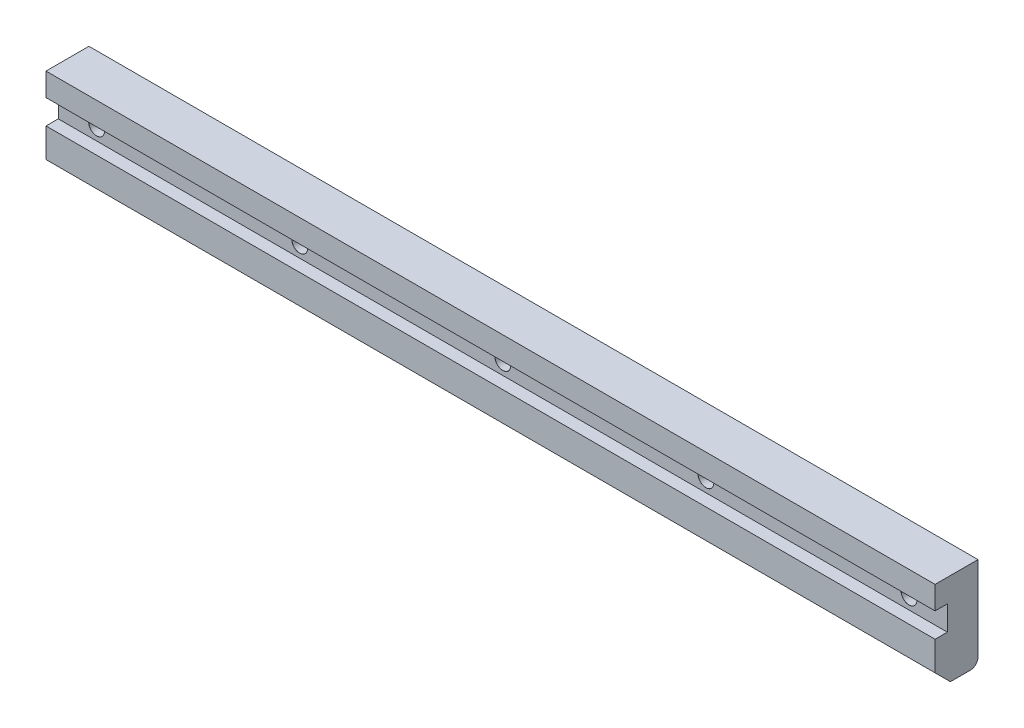
ISO-10303-21;
HEADER;
FILE_DESCRIPTION(('STEP AP214'),'2;1');
FILE_NAME('part.step','',(''),(''),'','','');
FILE_SCHEMA(('AUTOMOTIVE_DESIGN { 1 0 10303 214 1 1 1 1 }'));
ENDSEC;
DATA;
#1=APPLICATION_CONTEXT('core data for automotive mechanical design processes');
#2=APPLICATION_PROTOCOL_DEFINITION('international standard','automotive_design',2000,#1);
#3=PRODUCT_CONTEXT('',#1,'mechanical');
#4=PRODUCT('Part','Part','',(#3));
#5=PRODUCT_RELATED_PRODUCT_CATEGORY('part','',(#4));
#6=PRODUCT_DEFINITION_FORMATION('','',#4);
#7=PRODUCT_DEFINITION_CONTEXT('part definition',#1,'design');
#8=PRODUCT_DEFINITION('design','',#6,#7);
#9=PRODUCT_DEFINITION_SHAPE('','',#8);
#10=(LENGTH_UNIT() NAMED_UNIT(*) SI_UNIT(.MILLI.,.METRE.));
#11=(NAMED_UNIT(*) PLANE_ANGLE_UNIT() SI_UNIT($,.RADIAN.));
#12=(NAMED_UNIT(*) SI_UNIT($,.STERADIAN.) SOLID_ANGLE_UNIT());
#13=UNCERTAINTY_MEASURE_WITH_UNIT(LENGTH_MEASURE(1.E-05),#10,'distance_accuracy_value','');
#14=(GEOMETRIC_REPRESENTATION_CONTEXT(3) GLOBAL_UNCERTAINTY_ASSIGNED_CONTEXT((#13)) GLOBAL_UNIT_ASSIGNED_CONTEXT((#10,
#11,#12)) REPRESENTATION_CONTEXT('',''));
#15=CARTESIAN_POINT('',(0.,0.,0.));
#16=DIRECTION('',(0.,0.,1.));
#17=DIRECTION('',(1.,0.,0.));
#18=AXIS2_PLACEMENT_3D('',#15,#16,#17);
#19=CARTESIAN_POINT('',(290.,-55.,0.));
#20=DIRECTION('',(0.,0.,1.));
#21=DIRECTION('',(1.,0.,0.));
#22=AXIS2_PLACEMENT_3D('',#19,#20,#21);
#23=PLANE('',#22);
#24=CARTESIAN_POINT('',(-265.,-23.,0.));
#25=DIRECTION('',(0.,0.,1.));
#26=DIRECTION('',(1.,0.,0.));
#27=AXIS2_PLACEMENT_3D('',#24,#25,#26);
#28=CIRCLE('',#27,5.12499999999999);
#29=CARTESIAN_POINT('',(-259.875,-23.,0.));
#30=VERTEX_POINT('',#29);
#31=EDGE_CURVE('E289',#30,#30,#28,.T.);
#32=ORIENTED_EDGE('',*,*,#31,.T.);
#33=EDGE_LOOP('',(#32));
#34=FACE_BOUND('',#33,.T.);
#35=CARTESIAN_POINT('',(-132.5,-23.,0.));
#36=DIRECTION('',(0.,0.,1.));
#37=DIRECTION('',(1.,0.,0.));
#38=AXIS2_PLACEMENT_3D('',#35,#36,#37);
#39=CIRCLE('',#38,5.12499999999999);
#40=CARTESIAN_POINT('',(-127.375,-23.,0.));
#41=VERTEX_POINT('',#40);
#42=EDGE_CURVE('E277',#41,#41,#39,.T.);
#43=ORIENTED_EDGE('',*,*,#42,.T.);
#44=EDGE_LOOP('',(#43));
#45=FACE_BOUND('',#44,.T.);
#46=CARTESIAN_POINT('',(0.,-23.,0.));
#47=DIRECTION('',(0.,0.,1.));
#48=DIRECTION('',(1.,0.,0.));
#49=AXIS2_PLACEMENT_3D('',#46,#47,#48);
#50=CIRCLE('',#49,5.12499999999999);
#51=CARTESIAN_POINT('',(5.12500000000005,-23.,0.));
#52=VERTEX_POINT('',#51);
#53=EDGE_CURVE('E265',#52,#52,#50,.T.);
#54=ORIENTED_EDGE('',*,*,#53,.T.);
#55=EDGE_LOOP('',(#54));
#56=FACE_BOUND('',#55,.T.);
#57=CARTESIAN_POINT('',(132.5,-23.,0.));
#58=DIRECTION('',(0.,0.,1.));
#59=DIRECTION('',(1.,0.,0.));
#60=AXIS2_PLACEMENT_3D('',#57,#58,#59);
#61=CIRCLE('',#60,5.12499999999999);
#62=CARTESIAN_POINT('',(137.625,-23.,0.));
#63=VERTEX_POINT('',#62);
#64=EDGE_CURVE('E253',#63,#63,#61,.T.);
#65=ORIENTED_EDGE('',*,*,#64,.T.);
#66=EDGE_LOOP('',(#65));
#67=FACE_BOUND('',#66,.T.);
#68=CARTESIAN_POINT('',(265.,-23.,0.));
#69=DIRECTION('',(0.,0.,1.));
#70=DIRECTION('',(1.,0.,0.));
#71=AXIS2_PLACEMENT_3D('',#68,#69,#70);
#72=CIRCLE('',#71,5.12499999999999);
#73=CARTESIAN_POINT('',(270.125,-23.,0.));
#74=VERTEX_POINT('',#73);
#75=EDGE_CURVE('E156',#74,#74,#72,.T.);
#76=ORIENTED_EDGE('',*,*,#75,.T.);
#77=EDGE_LOOP('',(#76));
#78=FACE_BOUND('',#77,.T.);
#79=DIRECTION('',(0.,1.,0.));
#80=VECTOR('',#79,1.);
#81=CARTESIAN_POINT('',(-290.,-55.,0.));
#82=LINE('',#81,#80);
#83=CARTESIAN_POINT('',(-290.,-55.,0.));
#84=VERTEX_POINT('',#83);
#85=CARTESIAN_POINT('',(-290.,0.,0.));
#86=VERTEX_POINT('',#85);
#87=EDGE_CURVE('E151',#84,#86,#82,.T.);
#88=ORIENTED_EDGE('',*,*,#87,.T.);
#89=DIRECTION('',(-1.,0.,0.));
#90=VECTOR('',#89,1.);
#91=CARTESIAN_POINT('',(290.,0.,0.));
#92=LINE('',#91,#90);
#93=CARTESIAN_POINT('',(290.,0.,0.));
#94=VERTEX_POINT('',#93);
#95=EDGE_CURVE('E11',#94,#86,#92,.T.);
#96=ORIENTED_EDGE('',*,*,#95,.F.);
#97=DIRECTION('',(0.,1.,0.));
#98=VECTOR('',#97,1.);
#99=CARTESIAN_POINT('',(290.,-55.,0.));
#100=LINE('',#99,#98);
#101=CARTESIAN_POINT('',(290.,-55.,0.));
#102=VERTEX_POINT('',#101);
#103=EDGE_CURVE('E180',#102,#94,#100,.T.);
#104=ORIENTED_EDGE('',*,*,#103,.F.);
#105=DIRECTION('',(-1.,0.,0.));
#106=VECTOR('',#105,1.);
#107=CARTESIAN_POINT('',(290.,-55.,0.));
#108=LINE('',#107,#106);
#109=EDGE_CURVE('E147',#102,#84,#108,.T.);
#110=ORIENTED_EDGE('',*,*,#109,.T.);
#111=EDGE_LOOP('',(#88,#96,#104,#110));
#112=FACE_BOUND('',#111,.T.);
#113=ADVANCED_FACE('F38',(#34,#45,#56,#67,#78,#112),#23,.F.);
#114=CARTESIAN_POINT('',(290.,0.,0.));
#115=DIRECTION('',(0.,-1.,0.));
#116=DIRECTION('',(0.,0.,-1.));
#117=AXIS2_PLACEMENT_3D('',#114,#115,#116);
#118=PLANE('',#117);
#119=DIRECTION('',(0.,0.,1.));
#120=VECTOR('',#119,1.);
#121=CARTESIAN_POINT('',(-290.,0.,0.));
#122=LINE('',#121,#120);
#123=CARTESIAN_POINT('',(-290.,0.,28.));
#124=VERTEX_POINT('',#123);
#125=EDGE_CURVE('E155',#86,#124,#122,.T.);
#126=ORIENTED_EDGE('',*,*,#125,.T.);
#127=DIRECTION('',(-1.,0.,0.));
#128=VECTOR('',#127,1.);
#129=CARTESIAN_POINT('',(290.,0.,28.));
#130=LINE('',#129,#128);
#131=CARTESIAN_POINT('',(290.,0.,28.));
#132=VERTEX_POINT('',#131);
#133=EDGE_CURVE('E47',#132,#124,#130,.T.);
#134=ORIENTED_EDGE('',*,*,#133,.F.);
#135=DIRECTION('',(0.,0.,1.));
#136=VECTOR('',#135,1.);
#137=CARTESIAN_POINT('',(290.,0.,0.));
#138=LINE('',#137,#136);
#139=EDGE_CURVE('E104',#94,#132,#138,.T.);
#140=ORIENTED_EDGE('',*,*,#139,.F.);
#141=ORIENTED_EDGE('',*,*,#95,.T.);
#142=EDGE_LOOP('',(#126,#134,#140,#141));
#143=FACE_BOUND('',#142,.T.);
#144=ADVANCED_FACE('F333',(#143),#118,.F.);
#145=CARTESIAN_POINT('',(290.,0.,28.));
#146=DIRECTION('',(0.,0.,-1.));
#147=DIRECTION('',(-1.,0.,0.));
#148=AXIS2_PLACEMENT_3D('',#145,#146,#147);
#149=PLANE('',#148);
#150=DIRECTION('',(0.,-1.,0.));
#151=VECTOR('',#150,1.);
#152=CARTESIAN_POINT('',(-290.,0.,28.));
#153=LINE('',#152,#151);
#154=CARTESIAN_POINT('',(-290.,-15.,28.));
#155=VERTEX_POINT('',#154);
#156=EDGE_CURVE('E159',#124,#155,#153,.T.);
#157=ORIENTED_EDGE('',*,*,#156,.T.);
#158=DIRECTION('',(-1.,0.,0.));
#159=VECTOR('',#158,1.);
#160=CARTESIAN_POINT('',(290.,-15.,28.));
#161=LINE('',#160,#159);
#162=CARTESIAN_POINT('',(290.,-15.,28.));
#163=VERTEX_POINT('',#162);
#164=EDGE_CURVE('E199',#163,#155,#161,.T.);
#165=ORIENTED_EDGE('',*,*,#164,.F.);
#166=DIRECTION('',(0.,-1.,0.));
#167=VECTOR('',#166,1.);
#168=CARTESIAN_POINT('',(290.,0.,28.));
#169=LINE('',#168,#167);
#170=EDGE_CURVE('E209',#132,#163,#169,.T.);
#171=ORIENTED_EDGE('',*,*,#170,.F.);
#172=ORIENTED_EDGE('',*,*,#133,.T.);
#173=EDGE_LOOP('',(#157,#165,#171,#172));
#174=FACE_BOUND('',#173,.T.);
#175=ADVANCED_FACE('F207',(#174),#149,.F.);
#176=CARTESIAN_POINT('',(290.,-15.,28.));
#177=DIRECTION('',(0.,1.,0.));
#178=DIRECTION('',(0.,0.,1.));
#179=AXIS2_PLACEMENT_3D('',#176,#177,#178);
#180=PLANE('',#179);
#181=DIRECTION('',(0.,0.,-1.));
#182=VECTOR('',#181,1.);
#183=CARTESIAN_POINT('',(-290.,-15.,28.));
#184=LINE('',#183,#182);
#185=CARTESIAN_POINT('',(-290.,-15.,20.));
#186=VERTEX_POINT('',#185);
#187=EDGE_CURVE('E162',#155,#186,#184,.T.);
#188=ORIENTED_EDGE('',*,*,#187,.T.);
#189=DIRECTION('',(-1.,0.,0.));
#190=VECTOR('',#189,1.);
#191=CARTESIAN_POINT('',(290.,-15.,20.));
#192=LINE('',#191,#190);
#193=CARTESIAN_POINT('',(290.,-15.,20.));
#194=VERTEX_POINT('',#193);
#195=EDGE_CURVE('E195',#194,#186,#192,.T.);
#196=ORIENTED_EDGE('',*,*,#195,.F.);
#197=DIRECTION('',(0.,0.,-1.));
#198=VECTOR('',#197,1.);
#199=CARTESIAN_POINT('',(290.,-15.,28.));
#200=LINE('',#199,#198);
#201=EDGE_CURVE('E228',#163,#194,#200,.T.);
#202=ORIENTED_EDGE('',*,*,#201,.F.);
#203=ORIENTED_EDGE('',*,*,#164,.T.);
#204=EDGE_LOOP('',(#188,#196,#202,#203));
#205=FACE_BOUND('',#204,.T.);
#206=ADVANCED_FACE('F218',(#205),#180,.F.);
#207=CARTESIAN_POINT('',(290.,-15.,20.));
#208=DIRECTION('',(0.,0.,-1.));
#209=DIRECTION('',(-1.,0.,0.));
#210=AXIS2_PLACEMENT_3D('',#207,#208,#209);
#211=PLANE('',#210);
#212=CARTESIAN_POINT('',(-265.,-23.,20.));
#213=DIRECTION('',(0.,0.,1.));
#214=DIRECTION('',(1.,0.,0.));
#215=AXIS2_PLACEMENT_3D('',#212,#213,#214);
#216=CIRCLE('',#215,5.14999999999999);
#217=CARTESIAN_POINT('',(-259.85,-23.,20.));
#218=VERTEX_POINT('',#217);
#219=EDGE_CURVE('E297',#218,#218,#216,.T.);
#220=ORIENTED_EDGE('',*,*,#219,.F.);
#221=EDGE_LOOP('',(#220));
#222=FACE_BOUND('',#221,.T.);
#223=CARTESIAN_POINT('',(-132.5,-23.,20.));
#224=DIRECTION('',(0.,0.,1.));
#225=DIRECTION('',(1.,0.,0.));
#226=AXIS2_PLACEMENT_3D('',#223,#224,#225);
#227=CIRCLE('',#226,5.14999999999999);
#228=CARTESIAN_POINT('',(-127.35,-23.,20.));
#229=VERTEX_POINT('',#228);
#230=EDGE_CURVE('E285',#229,#229,#227,.T.);
#231=ORIENTED_EDGE('',*,*,#230,.F.);
#232=EDGE_LOOP('',(#231));
#233=FACE_BOUND('',#232,.T.);
#234=CARTESIAN_POINT('',(0.,-23.,20.));
#235=DIRECTION('',(0.,0.,1.));
#236=DIRECTION('',(1.,0.,0.));
#237=AXIS2_PLACEMENT_3D('',#234,#235,#236);
#238=CIRCLE('',#237,5.15);
#239=CARTESIAN_POINT('',(5.15000000000006,-23.,20.));
#240=VERTEX_POINT('',#239);
#241=EDGE_CURVE('E273',#240,#240,#238,.T.);
#242=ORIENTED_EDGE('',*,*,#241,.F.);
#243=EDGE_LOOP('',(#242));
#244=FACE_BOUND('',#243,.T.);
#245=CARTESIAN_POINT('',(132.5,-23.,20.));
#246=DIRECTION('',(0.,0.,1.));
#247=DIRECTION('',(1.,0.,0.));
#248=AXIS2_PLACEMENT_3D('',#245,#246,#247);
#249=CIRCLE('',#248,5.14999999999999);
#250=CARTESIAN_POINT('',(137.65,-23.,20.));
#251=VERTEX_POINT('',#250);
#252=EDGE_CURVE('E261',#251,#251,#249,.T.);
#253=ORIENTED_EDGE('',*,*,#252,.F.);
#254=EDGE_LOOP('',(#253));
#255=FACE_BOUND('',#254,.T.);
#256=CARTESIAN_POINT('',(265.,-23.,20.));
#257=DIRECTION('',(0.,0.,1.));
#258=DIRECTION('',(1.,0.,0.));
#259=AXIS2_PLACEMENT_3D('',#256,#257,#258);
#260=CIRCLE('',#259,5.14999999999999);
#261=CARTESIAN_POINT('',(270.15,-23.,20.));
#262=VERTEX_POINT('',#261);
#263=EDGE_CURVE('E249',#262,#262,#260,.T.);
#264=ORIENTED_EDGE('',*,*,#263,.F.);
#265=EDGE_LOOP('',(#264));
#266=FACE_BOUND('',#265,.T.);
#267=DIRECTION('',(0.,-1.,0.));
#268=VECTOR('',#267,1.);
#269=CARTESIAN_POINT('',(-290.,-15.,20.));
#270=LINE('',#269,#268);
#271=CARTESIAN_POINT('',(-290.,-31.,20.));
#272=VERTEX_POINT('',#271);
#273=EDGE_CURVE('E165',#186,#272,#270,.T.);
#274=ORIENTED_EDGE('',*,*,#273,.T.);
#275=DIRECTION('',(-1.,0.,0.));
#276=VECTOR('',#275,1.);
#277=CARTESIAN_POINT('',(290.,-31.,20.));
#278=LINE('',#277,#276);
#279=CARTESIAN_POINT('',(290.,-31.,20.));
#280=VERTEX_POINT('',#279);
#281=EDGE_CURVE('E191',#280,#272,#278,.T.);
#282=ORIENTED_EDGE('',*,*,#281,.F.);
#283=DIRECTION('',(0.,-1.,0.));
#284=VECTOR('',#283,1.);
#285=CARTESIAN_POINT('',(290.,-15.,20.));
#286=LINE('',#285,#284);
#287=EDGE_CURVE('E224',#194,#280,#286,.T.);
#288=ORIENTED_EDGE('',*,*,#287,.F.);
#289=ORIENTED_EDGE('',*,*,#195,.T.);
#290=EDGE_LOOP('',(#274,#282,#288,#289));
#291=FACE_BOUND('',#290,.T.);
#292=ADVANCED_FACE('F222',(#222,#233,#244,#255,#266,#291),#211,.F.);
#293=CARTESIAN_POINT('',(290.,-31.,20.));
#294=DIRECTION('',(0.,-1.,0.));
#295=DIRECTION('',(0.,0.,-1.));
#296=AXIS2_PLACEMENT_3D('',#293,#294,#295);
#297=PLANE('',#296);
#298=DIRECTION('',(0.,0.,1.));
#299=VECTOR('',#298,1.);
#300=CARTESIAN_POINT('',(-290.,-31.,20.));
#301=LINE('',#300,#299);
#302=CARTESIAN_POINT('',(-290.,-31.,28.));
#303=VERTEX_POINT('',#302);
#304=EDGE_CURVE('E168',#272,#303,#301,.T.);
#305=ORIENTED_EDGE('',*,*,#304,.T.);
#306=DIRECTION('',(-1.,0.,0.));
#307=VECTOR('',#306,1.);
#308=CARTESIAN_POINT('',(290.,-31.,28.));
#309=LINE('',#308,#307);
#310=CARTESIAN_POINT('',(290.,-31.,28.));
#311=VERTEX_POINT('',#310);
#312=EDGE_CURVE('E187',#311,#303,#309,.T.);
#313=ORIENTED_EDGE('',*,*,#312,.F.);
#314=DIRECTION('',(0.,0.,1.));
#315=VECTOR('',#314,1.);
#316=CARTESIAN_POINT('',(290.,-31.,20.));
#317=LINE('',#316,#315);
#318=EDGE_CURVE('E227',#280,#311,#317,.T.);
#319=ORIENTED_EDGE('',*,*,#318,.F.);
#320=ORIENTED_EDGE('',*,*,#281,.T.);
#321=EDGE_LOOP('',(#305,#313,#319,#320));
#322=FACE_BOUND('',#321,.T.);
#323=ADVANCED_FACE('F306',(#322),#297,.F.);
#324=CARTESIAN_POINT('',(290.,-31.,28.));
#325=DIRECTION('',(0.,0.,-1.));
#326=DIRECTION('',(0.,1.,0.));
#327=AXIS2_PLACEMENT_3D('',#324,#325,#326);
#328=PLANE('',#327);
#329=DIRECTION('',(0.,-1.,0.));
#330=VECTOR('',#329,1.);
#331=CARTESIAN_POINT('',(-290.,-31.,28.));
#332=LINE('',#331,#330);
#333=CARTESIAN_POINT('',(-290.,-50.,28.));
#334=VERTEX_POINT('',#333);
#335=EDGE_CURVE('E171',#303,#334,#332,.T.);
#336=ORIENTED_EDGE('',*,*,#335,.T.);
#337=DIRECTION('',(-1.,0.,0.));
#338=VECTOR('',#337,1.);
#339=CARTESIAN_POINT('',(290.,-50.,28.));
#340=LINE('',#339,#338);
#341=CARTESIAN_POINT('',(290.,-50.,28.));
#342=VERTEX_POINT('',#341);
#343=EDGE_CURVE('E140',#342,#334,#340,.T.);
#344=ORIENTED_EDGE('',*,*,#343,.F.);
#345=DIRECTION('',(0.,-1.,0.));
#346=VECTOR('',#345,1.);
#347=CARTESIAN_POINT('',(290.,-31.,28.));
#348=LINE('',#347,#346);
#349=EDGE_CURVE('E129',#311,#342,#348,.T.);
#350=ORIENTED_EDGE('',*,*,#349,.F.);
#351=ORIENTED_EDGE('',*,*,#312,.T.);
#352=EDGE_LOOP('',(#336,#344,#350,#351));
#353=FACE_BOUND('',#352,.T.);
#354=ADVANCED_FACE('F353',(#353),#328,.F.);
#355=CARTESIAN_POINT('',(290.,-50.,28.));
#356=DIRECTION('',(0.,0.707106781186548,-0.707106781186547));
#357=DIRECTION('',(0.,0.707106781186547,0.707106781186548));
#358=AXIS2_PLACEMENT_3D('',#355,#356,#357);
#359=PLANE('',#358);
#360=DIRECTION('',(0.,-0.707106781186547,-0.707106781186548));
#361=VECTOR('',#360,1.);
#362=CARTESIAN_POINT('',(-290.,-50.,28.));
#363=LINE('',#362,#361);
#364=CARTESIAN_POINT('',(-290.,-60.,18.));
#365=VERTEX_POINT('',#364);
#366=EDGE_CURVE('E138',#334,#365,#363,.T.);
#367=ORIENTED_EDGE('',*,*,#366,.T.);
#368=DIRECTION('',(-1.,0.,0.));
#369=VECTOR('',#368,1.);
#370=CARTESIAN_POINT('',(290.,-60.,18.));
#371=LINE('',#370,#369);
#372=CARTESIAN_POINT('',(290.,-60.,18.));
#373=VERTEX_POINT('',#372);
#374=EDGE_CURVE('E135',#373,#365,#371,.T.);
#375=ORIENTED_EDGE('',*,*,#374,.F.);
#376=DIRECTION('',(0.,-0.707106781186547,-0.707106781186548));
#377=VECTOR('',#376,1.);
#378=CARTESIAN_POINT('',(290.,-50.,28.));
#379=LINE('',#378,#377);
#380=EDGE_CURVE('E123',#342,#373,#379,.T.);
#381=ORIENTED_EDGE('',*,*,#380,.F.);
#382=ORIENTED_EDGE('',*,*,#343,.T.);
#383=EDGE_LOOP('',(#367,#375,#381,#382));
#384=FACE_BOUND('',#383,.T.);
#385=ADVANCED_FACE('F136',(#384),#359,.F.);
#386=CARTESIAN_POINT('',(290.,-60.,18.));
#387=DIRECTION('',(0.,1.,0.));
#388=DIRECTION('',(0.,0.,1.));
#389=AXIS2_PLACEMENT_3D('',#386,#387,#388);
#390=PLANE('',#389);
#391=DIRECTION('',(0.,0.,-1.));
#392=VECTOR('',#391,1.);
#393=CARTESIAN_POINT('',(-290.,-60.,18.));
#394=LINE('',#393,#392);
#395=CARTESIAN_POINT('',(-290.,-60.,5.00000000000003));
#396=VERTEX_POINT('',#395);
#397=EDGE_CURVE('E90',#365,#396,#394,.T.);
#398=ORIENTED_EDGE('',*,*,#397,.T.);
#399=DIRECTION('',(-1.,0.,0.));
#400=VECTOR('',#399,1.);
#401=CARTESIAN_POINT('',(290.,-60.,5.00000000000003));
#402=LINE('',#401,#400);
#403=CARTESIAN_POINT('',(290.,-60.,5.00000000000003));
#404=VERTEX_POINT('',#403);
#405=EDGE_CURVE('E141',#404,#396,#402,.T.);
#406=ORIENTED_EDGE('',*,*,#405,.F.);
#407=DIRECTION('',(0.,0.,-1.));
#408=VECTOR('',#407,1.);
#409=CARTESIAN_POINT('',(290.,-60.,18.));
#410=LINE('',#409,#408);
#411=EDGE_CURVE('E127',#373,#404,#410,.T.);
#412=ORIENTED_EDGE('',*,*,#411,.F.);
#413=ORIENTED_EDGE('',*,*,#374,.T.);
#414=EDGE_LOOP('',(#398,#406,#412,#413));
#415=FACE_BOUND('',#414,.T.);
#416=ADVANCED_FACE('F143',(#415),#390,.F.);
#417=CARTESIAN_POINT('',(290.,-55.,5.));
#418=DIRECTION('',(-1.,0.,0.));
#419=DIRECTION('',(0.,0.,1.));
#420=AXIS2_PLACEMENT_3D('',#417,#418,#419);
#421=CYLINDRICAL_SURFACE('',#420,5.);
#422=CARTESIAN_POINT('',(-290.,-55.,5.));
#423=DIRECTION('',(1.,0.,0.));
#424=DIRECTION('',(0.,0.,-1.));
#425=AXIS2_PLACEMENT_3D('',#422,#423,#424);
#426=CIRCLE('',#425,5.);
#427=EDGE_CURVE('E96',#396,#84,#426,.T.);
#428=ORIENTED_EDGE('',*,*,#427,.T.);
#429=ORIENTED_EDGE('',*,*,#109,.F.);
#430=CARTESIAN_POINT('',(290.,-55.,5.));
#431=DIRECTION('',(1.,0.,0.));
#432=DIRECTION('',(0.,0.,-1.));
#433=AXIS2_PLACEMENT_3D('',#430,#431,#432);
#434=CIRCLE('',#433,5.);
#435=EDGE_CURVE('E55',#404,#102,#434,.T.);
#436=ORIENTED_EDGE('',*,*,#435,.F.);
#437=ORIENTED_EDGE('',*,*,#405,.T.);
#438=EDGE_LOOP('',(#428,#429,#436,#437));
#439=FACE_BOUND('',#438,.T.);
#440=ADVANCED_FACE('F488',(#439),#421,.T.);
#441=CARTESIAN_POINT('',(290.,-55.,5.));
#442=DIRECTION('',(1.,0.,0.));
#443=DIRECTION('',(0.,0.,-1.));
#444=AXIS2_PLACEMENT_3D('',#441,#442,#443);
#445=PLANE('',#444);
#446=ORIENTED_EDGE('',*,*,#103,.T.);
#447=ORIENTED_EDGE('',*,*,#139,.T.);
#448=ORIENTED_EDGE('',*,*,#170,.T.);
#449=ORIENTED_EDGE('',*,*,#201,.T.);
#450=ORIENTED_EDGE('',*,*,#287,.T.);
#451=ORIENTED_EDGE('',*,*,#318,.T.);
#452=ORIENTED_EDGE('',*,*,#349,.T.);
#453=ORIENTED_EDGE('',*,*,#380,.T.);
#454=ORIENTED_EDGE('',*,*,#411,.T.);
#455=ORIENTED_EDGE('',*,*,#435,.T.);
#456=EDGE_LOOP('',(#446,#447,#448,#449,#450,#451,#452,#453,#454,#455));
#457=FACE_BOUND('',#456,.T.);
#458=ADVANCED_FACE('F125',(#457),#445,.T.);
#459=CARTESIAN_POINT('',(-290.,-55.,5.));
#460=DIRECTION('',(1.,0.,0.));
#461=DIRECTION('',(0.,0.,-1.));
#462=AXIS2_PLACEMENT_3D('',#459,#460,#461);
#463=PLANE('',#462);
#464=ORIENTED_EDGE('',*,*,#87,.F.);
#465=ORIENTED_EDGE('',*,*,#427,.F.);
#466=ORIENTED_EDGE('',*,*,#397,.F.);
#467=ORIENTED_EDGE('',*,*,#366,.F.);
#468=ORIENTED_EDGE('',*,*,#335,.F.);
#469=ORIENTED_EDGE('',*,*,#304,.F.);
#470=ORIENTED_EDGE('',*,*,#273,.F.);
#471=ORIENTED_EDGE('',*,*,#187,.F.);
#472=ORIENTED_EDGE('',*,*,#156,.F.);
#473=ORIENTED_EDGE('',*,*,#125,.F.);
#474=EDGE_LOOP('',(#464,#465,#466,#467,#468,#469,#470,#471,#472,#473));
#475=FACE_BOUND('',#474,.T.);
#476=ADVANCED_FACE('F213',(#475),#463,.F.);
#477=CARTESIAN_POINT('',(265.,-23.,20.));
#478=DIRECTION('',(0.,0.,1.));
#479=DIRECTION('',(1.,0.,0.));
#480=AXIS2_PLACEMENT_3D('',#477,#478,#479);
#481=CYLINDRICAL_SURFACE('',#480,5.12499999999999);
#482=ORIENTED_EDGE('',*,*,#75,.F.);
#483=EDGE_LOOP('',(#482));
#484=FACE_BOUND('',#483,.T.);
#485=CARTESIAN_POINT('',(265.,-23.,19.975));
#486=DIRECTION('',(0.,0.,1.));
#487=DIRECTION('',(1.,0.,0.));
#488=AXIS2_PLACEMENT_3D('',#485,#486,#487);
#489=CIRCLE('',#488,5.12499999999999);
#490=CARTESIAN_POINT('',(270.125,-23.,19.975));
#491=VERTEX_POINT('',#490);
#492=EDGE_CURVE('E245',#491,#491,#489,.T.);
#493=ORIENTED_EDGE('',*,*,#492,.T.);
#494=EDGE_LOOP('',(#493));
#495=FACE_BOUND('',#494,.T.);
#496=ADVANCED_FACE('F319',(#484,#495),#481,.F.);
#497=CARTESIAN_POINT('',(265.,-23.,20.));
#498=DIRECTION('',(0.,0.,1.));
#499=DIRECTION('',(1.,0.,0.));
#500=AXIS2_PLACEMENT_3D('',#497,#498,#499);
#501=CONICAL_SURFACE('',#500,5.14999999999999,0.785398163397379);
#502=ORIENTED_EDGE('',*,*,#492,.F.);
#503=EDGE_LOOP('',(#502));
#504=FACE_BOUND('',#503,.T.);
#505=ORIENTED_EDGE('',*,*,#263,.T.);
#506=EDGE_LOOP('',(#505));
#507=FACE_BOUND('',#506,.T.);
#508=ADVANCED_FACE('F316',(#504,#507),#501,.F.);
#509=CARTESIAN_POINT('',(132.5,-23.,20.));
#510=DIRECTION('',(0.,0.,1.));
#511=DIRECTION('',(1.,0.,0.));
#512=AXIS2_PLACEMENT_3D('',#509,#510,#511);
#513=CYLINDRICAL_SURFACE('',#512,5.12499999999999);
#514=ORIENTED_EDGE('',*,*,#64,.F.);
#515=EDGE_LOOP('',(#514));
#516=FACE_BOUND('',#515,.T.);
#517=CARTESIAN_POINT('',(132.5,-23.,19.975));
#518=DIRECTION('',(0.,0.,1.));
#519=DIRECTION('',(1.,0.,0.));
#520=AXIS2_PLACEMENT_3D('',#517,#518,#519);
#521=CIRCLE('',#520,5.12499999999999);
#522=CARTESIAN_POINT('',(137.625,-23.,19.975));
#523=VERTEX_POINT('',#522);
#524=EDGE_CURVE('E257',#523,#523,#521,.T.);
#525=ORIENTED_EDGE('',*,*,#524,.T.);
#526=EDGE_LOOP('',(#525));
#527=FACE_BOUND('',#526,.T.);
#528=ADVANCED_FACE('F318',(#516,#527),#513,.F.);
#529=CARTESIAN_POINT('',(132.5,-23.,20.));
#530=DIRECTION('',(0.,0.,1.));
#531=DIRECTION('',(1.,0.,0.));
#532=AXIS2_PLACEMENT_3D('',#529,#530,#531);
#533=CONICAL_SURFACE('',#532,5.14999999999999,0.785398163397379);
#534=ORIENTED_EDGE('',*,*,#524,.F.);
#535=EDGE_LOOP('',(#534));
#536=FACE_BOUND('',#535,.T.);
#537=ORIENTED_EDGE('',*,*,#252,.T.);
#538=EDGE_LOOP('',(#537));
#539=FACE_BOUND('',#538,.T.);
#540=ADVANCED_FACE('F326',(#536,#539),#533,.F.);
#541=CARTESIAN_POINT('',(0.,-23.,20.));
#542=DIRECTION('',(0.,0.,1.));
#543=DIRECTION('',(1.,0.,0.));
#544=AXIS2_PLACEMENT_3D('',#541,#542,#543);
#545=CYLINDRICAL_SURFACE('',#544,5.12499999999999);
#546=ORIENTED_EDGE('',*,*,#53,.F.);
#547=EDGE_LOOP('',(#546));
#548=FACE_BOUND('',#547,.T.);
#549=CARTESIAN_POINT('',(0.,-23.,19.975));
#550=DIRECTION('',(0.,0.,1.));
#551=DIRECTION('',(1.,0.,0.));
#552=AXIS2_PLACEMENT_3D('',#549,#550,#551);
#553=CIRCLE('',#552,5.12499999999999);
#554=CARTESIAN_POINT('',(5.12500000000005,-23.,19.975));
#555=VERTEX_POINT('',#554);
#556=EDGE_CURVE('E269',#555,#555,#553,.T.);
#557=ORIENTED_EDGE('',*,*,#556,.T.);
#558=EDGE_LOOP('',(#557));
#559=FACE_BOUND('',#558,.T.);
#560=ADVANCED_FACE('F407',(#548,#559),#545,.F.);
#561=CARTESIAN_POINT('',(0.,-23.,20.));
#562=DIRECTION('',(0.,0.,1.));
#563=DIRECTION('',(1.,0.,0.));
#564=AXIS2_PLACEMENT_3D('',#561,#562,#563);
#565=CONICAL_SURFACE('',#564,5.15,0.78539816339757);
#566=ORIENTED_EDGE('',*,*,#556,.F.);
#567=EDGE_LOOP('',(#566));
#568=FACE_BOUND('',#567,.T.);
#569=ORIENTED_EDGE('',*,*,#241,.T.);
#570=EDGE_LOOP('',(#569));
#571=FACE_BOUND('',#570,.T.);
#572=ADVANCED_FACE('F417',(#568,#571),#565,.F.);
#573=CARTESIAN_POINT('',(-132.5,-23.,20.));
#574=DIRECTION('',(0.,0.,1.));
#575=DIRECTION('',(1.,0.,0.));
#576=AXIS2_PLACEMENT_3D('',#573,#574,#575);
#577=CYLINDRICAL_SURFACE('',#576,5.12499999999999);
#578=ORIENTED_EDGE('',*,*,#42,.F.);
#579=EDGE_LOOP('',(#578));
#580=FACE_BOUND('',#579,.T.);
#581=CARTESIAN_POINT('',(-132.5,-23.,19.975));
#582=DIRECTION('',(0.,0.,1.));
#583=DIRECTION('',(1.,0.,0.));
#584=AXIS2_PLACEMENT_3D('',#581,#582,#583);
#585=CIRCLE('',#584,5.12499999999999);
#586=CARTESIAN_POINT('',(-127.375,-23.,19.975));
#587=VERTEX_POINT('',#586);
#588=EDGE_CURVE('E281',#587,#587,#585,.T.);
#589=ORIENTED_EDGE('',*,*,#588,.T.);
#590=EDGE_LOOP('',(#589));
#591=FACE_BOUND('',#590,.T.);
#592=ADVANCED_FACE('F427',(#580,#591),#577,.F.);
#593=CARTESIAN_POINT('',(-132.5,-23.,20.));
#594=DIRECTION('',(0.,0.,1.));
#595=DIRECTION('',(1.,0.,0.));
#596=AXIS2_PLACEMENT_3D('',#593,#594,#595);
#597=CONICAL_SURFACE('',#596,5.14999999999999,0.785398163397379);
#598=ORIENTED_EDGE('',*,*,#588,.F.);
#599=EDGE_LOOP('',(#598));
#600=FACE_BOUND('',#599,.T.);
#601=ORIENTED_EDGE('',*,*,#230,.T.);
#602=EDGE_LOOP('',(#601));
#603=FACE_BOUND('',#602,.T.);
#604=ADVANCED_FACE('F437',(#600,#603),#597,.F.);
#605=CARTESIAN_POINT('',(-265.,-23.,20.));
#606=DIRECTION('',(0.,0.,1.));
#607=DIRECTION('',(1.,0.,0.));
#608=AXIS2_PLACEMENT_3D('',#605,#606,#607);
#609=CYLINDRICAL_SURFACE('',#608,5.12499999999999);
#610=ORIENTED_EDGE('',*,*,#31,.F.);
#611=EDGE_LOOP('',(#610));
#612=FACE_BOUND('',#611,.T.);
#613=CARTESIAN_POINT('',(-265.,-23.,19.975));
#614=DIRECTION('',(0.,0.,1.));
#615=DIRECTION('',(1.,0.,0.));
#616=AXIS2_PLACEMENT_3D('',#613,#614,#615);
#617=CIRCLE('',#616,5.12499999999999);
#618=CARTESIAN_POINT('',(-259.875,-23.,19.975));
#619=VERTEX_POINT('',#618);
#620=EDGE_CURVE('E293',#619,#619,#617,.T.);
#621=ORIENTED_EDGE('',*,*,#620,.T.);
#622=EDGE_LOOP('',(#621));
#623=FACE_BOUND('',#622,.T.);
#624=ADVANCED_FACE('F447',(#612,#623),#609,.F.);
#625=CARTESIAN_POINT('',(-265.,-23.,20.));
#626=DIRECTION('',(0.,0.,1.));
#627=DIRECTION('',(1.,0.,0.));
#628=AXIS2_PLACEMENT_3D('',#625,#626,#627);
#629=CONICAL_SURFACE('',#628,5.14999999999999,0.785398163397379);
#630=ORIENTED_EDGE('',*,*,#620,.F.);
#631=EDGE_LOOP('',(#630));
#632=FACE_BOUND('',#631,.T.);
#633=ORIENTED_EDGE('',*,*,#219,.T.);
#634=EDGE_LOOP('',(#633));
#635=FACE_BOUND('',#634,.T.);
#636=ADVANCED_FACE('F302',(#632,#635),#629,.F.);
#637=CLOSED_SHELL('',(#113,#144,#175,#206,#292,#323,#354,#385,#416,#440,#458,#476,#496,#508,
#528,#540,#560,#572,#592,#604,#624,#636));
#638=MANIFOLD_SOLID_BREP('B2',#637);
#639=ADVANCED_BREP_SHAPE_REPRESENTATION('',(#18,#638),#14);
#640=SHAPE_DEFINITION_REPRESENTATION(#9,#639);
ENDSEC;
END-ISO-10303-21;
